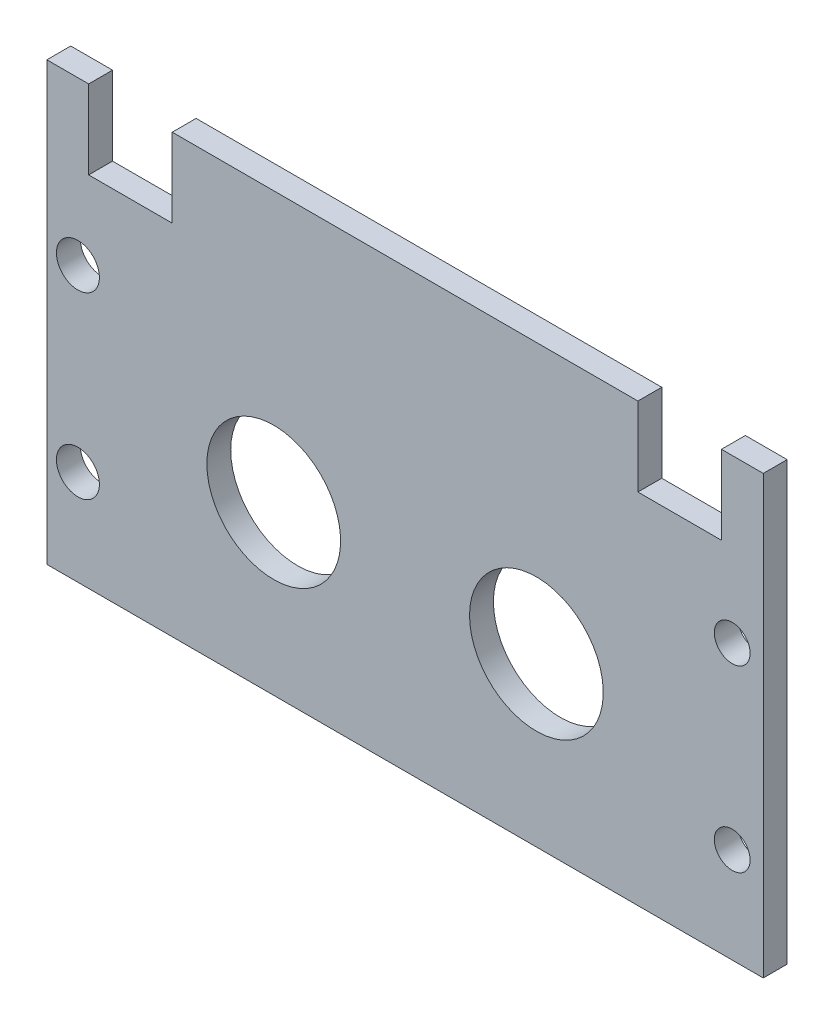
ISO-10303-21;
HEADER;
FILE_DESCRIPTION(('STEP AP214'),'2;1');
FILE_NAME('part.step','',(''),(''),'','','');
FILE_SCHEMA(('AUTOMOTIVE_DESIGN { 1 0 10303 214 1 1 1 1 }'));
ENDSEC;
DATA;
#1=APPLICATION_CONTEXT('core data for automotive mechanical design processes');
#2=APPLICATION_PROTOCOL_DEFINITION('international standard','automotive_design',2000,#1);
#3=PRODUCT_CONTEXT('',#1,'mechanical');
#4=PRODUCT('Part','Part','',(#3));
#5=PRODUCT_RELATED_PRODUCT_CATEGORY('part','',(#4));
#6=PRODUCT_DEFINITION_FORMATION('','',#4);
#7=PRODUCT_DEFINITION_CONTEXT('part definition',#1,'design');
#8=PRODUCT_DEFINITION('design','',#6,#7);
#9=PRODUCT_DEFINITION_SHAPE('','',#8);
#10=(LENGTH_UNIT() NAMED_UNIT(*) SI_UNIT(.MILLI.,.METRE.));
#11=(NAMED_UNIT(*) PLANE_ANGLE_UNIT() SI_UNIT($,.RADIAN.));
#12=(NAMED_UNIT(*) SI_UNIT($,.STERADIAN.) SOLID_ANGLE_UNIT());
#13=UNCERTAINTY_MEASURE_WITH_UNIT(LENGTH_MEASURE(1.E-05),#10,'distance_accuracy_value','');
#14=(GEOMETRIC_REPRESENTATION_CONTEXT(3) GLOBAL_UNCERTAINTY_ASSIGNED_CONTEXT((#13)) GLOBAL_UNIT_ASSIGNED_CONTEXT((#10,
#11,#12)) REPRESENTATION_CONTEXT('',''));
#15=CARTESIAN_POINT('',(0.,0.,0.));
#16=DIRECTION('',(0.,0.,1.));
#17=DIRECTION('',(1.,0.,0.));
#18=AXIS2_PLACEMENT_3D('',#15,#16,#17);
#19=CARTESIAN_POINT('',(-150.,75.,-10.));
#20=DIRECTION('',(0.,1.,0.));
#21=DIRECTION('',(0.,0.,1.));
#22=AXIS2_PLACEMENT_3D('',#19,#20,#21);
#23=PLANE('',#22);
#24=DIRECTION('',(0.,0.,-1.));
#25=VECTOR('',#24,1.);
#26=CARTESIAN_POINT('',(-97.5,75.,0.));
#27=LINE('',#26,#25);
#28=CARTESIAN_POINT('',(-97.5,75.,0.));
#29=VERTEX_POINT('',#28);
#30=CARTESIAN_POINT('',(-97.5,75.,-10.));
#31=VERTEX_POINT('',#30);
#32=EDGE_CURVE('E174',#29,#31,#27,.T.);
#33=ORIENTED_EDGE('',*,*,#32,.T.);
#34=DIRECTION('',(-1.,0.,0.));
#35=VECTOR('',#34,1.);
#36=CARTESIAN_POINT('',(-150.,75.,-10.));
#37=LINE('',#36,#35);
#38=CARTESIAN_POINT('',(-132.5,75.,-10.));
#39=VERTEX_POINT('',#38);
#40=EDGE_CURVE('E241',#31,#39,#37,.T.);
#41=ORIENTED_EDGE('',*,*,#40,.T.);
#42=DIRECTION('',(0.,0.,-1.));
#43=VECTOR('',#42,1.);
#44=CARTESIAN_POINT('',(-132.5,75.,0.));
#45=LINE('',#44,#43);
#46=CARTESIAN_POINT('',(-132.5,75.,0.));
#47=VERTEX_POINT('',#46);
#48=EDGE_CURVE('E196',#47,#39,#45,.T.);
#49=ORIENTED_EDGE('',*,*,#48,.F.);
#50=DIRECTION('',(-1.,0.,0.));
#51=VECTOR('',#50,1.);
#52=CARTESIAN_POINT('',(-150.,75.,0.));
#53=LINE('',#52,#51);
#54=EDGE_CURVE('E252',#29,#47,#53,.T.);
#55=ORIENTED_EDGE('',*,*,#54,.F.);
#56=EDGE_LOOP('',(#33,#41,#49,#55));
#57=FACE_BOUND('',#56,.T.);
#58=ADVANCED_FACE('F41',(#57),#23,.T.);
#59=CARTESIAN_POINT('',(150.,-75.,-10.));
#60=DIRECTION('',(1.,0.,0.));
#61=DIRECTION('',(0.,0.,-1.));
#62=AXIS2_PLACEMENT_3D('',#59,#60,#61);
#63=PLANE('',#62);
#64=DIRECTION('',(0.,1.,0.));
#65=VECTOR('',#64,1.);
#66=CARTESIAN_POINT('',(150.,-75.,0.));
#67=LINE('',#66,#65);
#68=CARTESIAN_POINT('',(150.,-75.,0.));
#69=VERTEX_POINT('',#68);
#70=CARTESIAN_POINT('',(150.,108.,0.));
#71=VERTEX_POINT('',#70);
#72=EDGE_CURVE('E143',#69,#71,#67,.T.);
#73=ORIENTED_EDGE('',*,*,#72,.F.);
#74=DIRECTION('',(0.,0.,1.));
#75=VECTOR('',#74,1.);
#76=CARTESIAN_POINT('',(150.,-75.,-10.));
#77=LINE('',#76,#75);
#78=CARTESIAN_POINT('',(150.,-75.,-10.));
#79=VERTEX_POINT('',#78);
#80=EDGE_CURVE('E11',#79,#69,#77,.T.);
#81=ORIENTED_EDGE('',*,*,#80,.F.);
#82=DIRECTION('',(0.,1.,0.));
#83=VECTOR('',#82,1.);
#84=CARTESIAN_POINT('',(150.,-75.,-10.));
#85=LINE('',#84,#83);
#86=CARTESIAN_POINT('',(150.,108.,-10.));
#87=VERTEX_POINT('',#86);
#88=EDGE_CURVE('E239',#79,#87,#85,.T.);
#89=ORIENTED_EDGE('',*,*,#88,.T.);
#90=DIRECTION('',(0.,0.,-1.));
#91=VECTOR('',#90,1.);
#92=CARTESIAN_POINT('',(150.,108.,0.));
#93=LINE('',#92,#91);
#94=EDGE_CURVE('E138',#71,#87,#93,.T.);
#95=ORIENTED_EDGE('',*,*,#94,.F.);
#96=EDGE_LOOP('',(#73,#81,#89,#95));
#97=FACE_BOUND('',#96,.T.);
#98=ADVANCED_FACE('F43',(#97),#63,.T.);
#99=CARTESIAN_POINT('',(-150.,-75.,-10.));
#100=DIRECTION('',(0.,-1.,0.));
#101=DIRECTION('',(0.,0.,-1.));
#102=AXIS2_PLACEMENT_3D('',#99,#100,#101);
#103=PLANE('',#102);
#104=DIRECTION('',(1.,0.,0.));
#105=VECTOR('',#104,1.);
#106=CARTESIAN_POINT('',(-150.,-75.,0.));
#107=LINE('',#106,#105);
#108=CARTESIAN_POINT('',(-150.,-75.,0.));
#109=VERTEX_POINT('',#108);
#110=EDGE_CURVE('E242',#109,#69,#107,.T.);
#111=ORIENTED_EDGE('',*,*,#110,.F.);
#112=DIRECTION('',(0.,0.,1.));
#113=VECTOR('',#112,1.);
#114=CARTESIAN_POINT('',(-150.,-75.,-10.));
#115=LINE('',#114,#113);
#116=CARTESIAN_POINT('',(-150.,-75.,-10.));
#117=VERTEX_POINT('',#116);
#118=EDGE_CURVE('E45',#117,#109,#115,.T.);
#119=ORIENTED_EDGE('',*,*,#118,.F.);
#120=DIRECTION('',(1.,0.,0.));
#121=VECTOR('',#120,1.);
#122=CARTESIAN_POINT('',(-150.,-75.,-10.));
#123=LINE('',#122,#121);
#124=EDGE_CURVE('E248',#117,#79,#123,.T.);
#125=ORIENTED_EDGE('',*,*,#124,.T.);
#126=ORIENTED_EDGE('',*,*,#80,.T.);
#127=EDGE_LOOP('',(#111,#119,#125,#126));
#128=FACE_BOUND('',#127,.T.);
#129=ADVANCED_FACE('F261',(#128),#103,.T.);
#130=CARTESIAN_POINT('',(-150.,-75.,-10.));
#131=DIRECTION('',(-1.,0.,0.));
#132=DIRECTION('',(0.,0.,1.));
#133=AXIS2_PLACEMENT_3D('',#130,#131,#132);
#134=PLANE('',#133);
#135=DIRECTION('',(0.,-1.,0.));
#136=VECTOR('',#135,1.);
#137=CARTESIAN_POINT('',(-150.,-75.,0.));
#138=LINE('',#137,#136);
#139=CARTESIAN_POINT('',(-150.,108.,0.));
#140=VERTEX_POINT('',#139);
#141=EDGE_CURVE('E255',#140,#109,#138,.T.);
#142=ORIENTED_EDGE('',*,*,#141,.F.);
#143=DIRECTION('',(0.,0.,-1.));
#144=VECTOR('',#143,1.);
#145=CARTESIAN_POINT('',(-150.,108.,0.));
#146=LINE('',#145,#144);
#147=CARTESIAN_POINT('',(-150.,108.,-10.));
#148=VERTEX_POINT('',#147);
#149=EDGE_CURVE('E191',#140,#148,#146,.T.);
#150=ORIENTED_EDGE('',*,*,#149,.T.);
#151=DIRECTION('',(0.,-1.,0.));
#152=VECTOR('',#151,1.);
#153=CARTESIAN_POINT('',(-150.,-75.,-10.));
#154=LINE('',#153,#152);
#155=EDGE_CURVE('E245',#148,#117,#154,.T.);
#156=ORIENTED_EDGE('',*,*,#155,.T.);
#157=ORIENTED_EDGE('',*,*,#118,.T.);
#158=EDGE_LOOP('',(#142,#150,#156,#157));
#159=FACE_BOUND('',#158,.T.);
#160=ADVANCED_FACE('F292',(#159),#134,.T.);
#161=DIRECTION('',(0.,0.,-1.));
#162=VECTOR('',#161,1.);
#163=CARTESIAN_POINT('',(132.5,75.,0.));
#164=LINE('',#163,#162);
#165=CARTESIAN_POINT('',(132.5,75.,0.));
#166=VERTEX_POINT('',#165);
#167=CARTESIAN_POINT('',(132.5,75.,-10.));
#168=VERTEX_POINT('',#167);
#169=EDGE_CURVE('E148',#166,#168,#164,.T.);
#170=ORIENTED_EDGE('',*,*,#169,.T.);
#171=CARTESIAN_POINT('',(97.5,75.,-10.));
#172=VERTEX_POINT('',#171);
#173=EDGE_CURVE('E243',#168,#172,#37,.T.);
#174=ORIENTED_EDGE('',*,*,#173,.T.);
#175=DIRECTION('',(0.,0.,-1.));
#176=VECTOR('',#175,1.);
#177=CARTESIAN_POINT('',(97.5,75.,0.));
#178=LINE('',#177,#176);
#179=CARTESIAN_POINT('',(97.5,75.,0.));
#180=VERTEX_POINT('',#179);
#181=EDGE_CURVE('E178',#180,#172,#178,.T.);
#182=ORIENTED_EDGE('',*,*,#181,.F.);
#183=EDGE_CURVE('E253',#166,#180,#53,.T.);
#184=ORIENTED_EDGE('',*,*,#183,.F.);
#185=EDGE_LOOP('',(#170,#174,#182,#184));
#186=FACE_BOUND('',#185,.T.);
#187=ADVANCED_FACE('F269',(#186),#23,.T.);
#188=CARTESIAN_POINT('',(0.,0.,-10.));
#189=DIRECTION('',(0.,0.,-1.));
#190=DIRECTION('',(-1.,0.,0.));
#191=AXIS2_PLACEMENT_3D('',#188,#189,#190);
#192=PLANE('',#191);
#193=CARTESIAN_POINT('',(-137.,-35.0000000000001,-10.));
#194=DIRECTION('',(0.,0.,-1.));
#195=DIRECTION('',(-1.,0.,0.));
#196=AXIS2_PLACEMENT_3D('',#193,#194,#195);
#197=CIRCLE('',#196,8.99999999999995);
#198=CARTESIAN_POINT('',(-146.,-35.0000000000001,-10.));
#199=VERTEX_POINT('',#198);
#200=EDGE_CURVE('E208',#199,#199,#197,.T.);
#201=ORIENTED_EDGE('',*,*,#200,.F.);
#202=EDGE_LOOP('',(#201));
#203=FACE_BOUND('',#202,.T.);
#204=CARTESIAN_POINT('',(-137.000000000001,40.,-10.));
#205=DIRECTION('',(0.,0.,-1.));
#206=DIRECTION('',(-1.,0.,0.));
#207=AXIS2_PLACEMENT_3D('',#204,#205,#206);
#208=CIRCLE('',#207,9.00000000000001);
#209=CARTESIAN_POINT('',(-146.000000000001,40.,-10.));
#210=VERTEX_POINT('',#209);
#211=EDGE_CURVE('E199',#210,#210,#208,.T.);
#212=ORIENTED_EDGE('',*,*,#211,.F.);
#213=EDGE_LOOP('',(#212));
#214=FACE_BOUND('',#213,.T.);
#215=CARTESIAN_POINT('',(137.,-35.,-10.));
#216=DIRECTION('',(0.,0.,-1.));
#217=DIRECTION('',(-1.,0.,0.));
#218=AXIS2_PLACEMENT_3D('',#215,#216,#217);
#219=CIRCLE('',#218,7.50000000000001);
#220=CARTESIAN_POINT('',(129.5,-35.,-10.));
#221=VERTEX_POINT('',#220);
#222=EDGE_CURVE('E220',#221,#221,#219,.T.);
#223=ORIENTED_EDGE('',*,*,#222,.F.);
#224=EDGE_LOOP('',(#223));
#225=FACE_BOUND('',#224,.T.);
#226=CARTESIAN_POINT('',(137.,40.,-10.));
#227=DIRECTION('',(0.,0.,-1.));
#228=DIRECTION('',(-1.,0.,0.));
#229=AXIS2_PLACEMENT_3D('',#226,#227,#228);
#230=CIRCLE('',#229,7.50000000000001);
#231=CARTESIAN_POINT('',(129.5,40.,-10.));
#232=VERTEX_POINT('',#231);
#233=EDGE_CURVE('E207',#232,#232,#230,.T.);
#234=ORIENTED_EDGE('',*,*,#233,.F.);
#235=EDGE_LOOP('',(#234));
#236=FACE_BOUND('',#235,.T.);
#237=CARTESIAN_POINT('',(55.,-4.99999999999999,-10.));
#238=DIRECTION('',(0.,0.,-1.));
#239=DIRECTION('',(-1.,0.,0.));
#240=AXIS2_PLACEMENT_3D('',#237,#238,#239);
#241=CIRCLE('',#240,28.);
#242=CARTESIAN_POINT('',(27.,-4.99999999999999,-10.));
#243=VERTEX_POINT('',#242);
#244=EDGE_CURVE('E231',#243,#243,#241,.T.);
#245=ORIENTED_EDGE('',*,*,#244,.F.);
#246=EDGE_LOOP('',(#245));
#247=FACE_BOUND('',#246,.T.);
#248=CARTESIAN_POINT('',(-55.,-4.99999999999999,-10.));
#249=DIRECTION('',(0.,0.,-1.));
#250=DIRECTION('',(-1.,0.,0.));
#251=AXIS2_PLACEMENT_3D('',#248,#249,#250);
#252=CIRCLE('',#251,28.);
#253=CARTESIAN_POINT('',(-83.,-4.99999999999999,-10.));
#254=VERTEX_POINT('',#253);
#255=EDGE_CURVE('E219',#254,#254,#252,.T.);
#256=ORIENTED_EDGE('',*,*,#255,.F.);
#257=EDGE_LOOP('',(#256));
#258=FACE_BOUND('',#257,.T.);
#259=ORIENTED_EDGE('',*,*,#88,.F.);
#260=ORIENTED_EDGE('',*,*,#124,.F.);
#261=ORIENTED_EDGE('',*,*,#155,.F.);
#262=DIRECTION('',(1.,0.,0.));
#263=VECTOR('',#262,1.);
#264=CARTESIAN_POINT('',(-150.,108.,-10.));
#265=LINE('',#264,#263);
#266=CARTESIAN_POINT('',(-132.5,108.,-10.));
#267=VERTEX_POINT('',#266);
#268=EDGE_CURVE('E177',#148,#267,#265,.T.);
#269=ORIENTED_EDGE('',*,*,#268,.T.);
#270=DIRECTION('',(0.,-1.,0.));
#271=VECTOR('',#270,1.);
#272=CARTESIAN_POINT('',(-132.5,75.,-10.));
#273=LINE('',#272,#271);
#274=EDGE_CURVE('E188',#267,#39,#273,.T.);
#275=ORIENTED_EDGE('',*,*,#274,.T.);
#276=ORIENTED_EDGE('',*,*,#40,.F.);
#277=DIRECTION('',(0.,1.,0.));
#278=VECTOR('',#277,1.);
#279=CARTESIAN_POINT('',(-97.5,75.,-10.));
#280=LINE('',#279,#278);
#281=CARTESIAN_POINT('',(-97.5,108.,-10.));
#282=VERTEX_POINT('',#281);
#283=EDGE_CURVE('E156',#31,#282,#280,.T.);
#284=ORIENTED_EDGE('',*,*,#283,.T.);
#285=DIRECTION('',(1.,0.,0.));
#286=VECTOR('',#285,1.);
#287=CARTESIAN_POINT('',(-97.5,108.,-10.));
#288=LINE('',#287,#286);
#289=CARTESIAN_POINT('',(97.5,108.,-10.));
#290=VERTEX_POINT('',#289);
#291=EDGE_CURVE('E169',#282,#290,#288,.T.);
#292=ORIENTED_EDGE('',*,*,#291,.T.);
#293=DIRECTION('',(0.,-1.,0.));
#294=VECTOR('',#293,1.);
#295=CARTESIAN_POINT('',(97.5,75.,-10.));
#296=LINE('',#295,#294);
#297=EDGE_CURVE('E160',#290,#172,#296,.T.);
#298=ORIENTED_EDGE('',*,*,#297,.T.);
#299=ORIENTED_EDGE('',*,*,#173,.F.);
#300=DIRECTION('',(0.,1.,0.));
#301=VECTOR('',#300,1.);
#302=CARTESIAN_POINT('',(132.5,75.,-10.));
#303=LINE('',#302,#301);
#304=CARTESIAN_POINT('',(132.5,108.,-10.));
#305=VERTEX_POINT('',#304);
#306=EDGE_CURVE('E151',#168,#305,#303,.T.);
#307=ORIENTED_EDGE('',*,*,#306,.T.);
#308=DIRECTION('',(1.,0.,0.));
#309=VECTOR('',#308,1.);
#310=CARTESIAN_POINT('',(132.5,108.,-10.));
#311=LINE('',#310,#309);
#312=EDGE_CURVE('E135',#305,#87,#311,.T.);
#313=ORIENTED_EDGE('',*,*,#312,.T.);
#314=EDGE_LOOP('',(#259,#260,#261,#269,#275,#276,#284,#292,#298,#299,#307,#313));
#315=FACE_BOUND('',#314,.T.);
#316=ADVANCED_FACE('F266',(#203,#214,#225,#236,#247,#258,#315),#192,.T.);
#317=CARTESIAN_POINT('',(0.,0.,0.));
#318=DIRECTION('',(0.,0.,-1.));
#319=DIRECTION('',(-1.,0.,0.));
#320=AXIS2_PLACEMENT_3D('',#317,#318,#319);
#321=PLANE('',#320);
#322=CARTESIAN_POINT('',(-137.,-35.0000000000001,0.));
#323=DIRECTION('',(0.,0.,-1.));
#324=DIRECTION('',(-1.,0.,0.));
#325=AXIS2_PLACEMENT_3D('',#322,#323,#324);
#326=CIRCLE('',#325,8.99999999999995);
#327=CARTESIAN_POINT('',(-146.,-35.0000000000001,0.));
#328=VERTEX_POINT('',#327);
#329=EDGE_CURVE('E204',#328,#328,#326,.T.);
#330=ORIENTED_EDGE('',*,*,#329,.T.);
#331=EDGE_LOOP('',(#330));
#332=FACE_BOUND('',#331,.T.);
#333=CARTESIAN_POINT('',(-137.000000000001,40.,0.));
#334=DIRECTION('',(0.,0.,-1.));
#335=DIRECTION('',(-1.,0.,0.));
#336=AXIS2_PLACEMENT_3D('',#333,#334,#335);
#337=CIRCLE('',#336,9.00000000000001);
#338=CARTESIAN_POINT('',(-146.000000000001,40.,0.));
#339=VERTEX_POINT('',#338);
#340=EDGE_CURVE('E211',#339,#339,#337,.T.);
#341=ORIENTED_EDGE('',*,*,#340,.T.);
#342=EDGE_LOOP('',(#341));
#343=FACE_BOUND('',#342,.T.);
#344=CARTESIAN_POINT('',(137.,-35.,0.));
#345=DIRECTION('',(0.,0.,-1.));
#346=DIRECTION('',(-1.,0.,0.));
#347=AXIS2_PLACEMENT_3D('',#344,#345,#346);
#348=CIRCLE('',#347,7.50000000000001);
#349=CARTESIAN_POINT('',(129.5,-35.,0.));
#350=VERTEX_POINT('',#349);
#351=EDGE_CURVE('E216',#350,#350,#348,.T.);
#352=ORIENTED_EDGE('',*,*,#351,.T.);
#353=EDGE_LOOP('',(#352));
#354=FACE_BOUND('',#353,.T.);
#355=CARTESIAN_POINT('',(137.,40.,0.));
#356=DIRECTION('',(0.,0.,-1.));
#357=DIRECTION('',(-1.,0.,0.));
#358=AXIS2_PLACEMENT_3D('',#355,#356,#357);
#359=CIRCLE('',#358,7.50000000000001);
#360=CARTESIAN_POINT('',(129.5,40.,0.));
#361=VERTEX_POINT('',#360);
#362=EDGE_CURVE('E223',#361,#361,#359,.T.);
#363=ORIENTED_EDGE('',*,*,#362,.T.);
#364=EDGE_LOOP('',(#363));
#365=FACE_BOUND('',#364,.T.);
#366=CARTESIAN_POINT('',(55.,-4.99999999999999,0.));
#367=DIRECTION('',(0.,0.,-1.));
#368=DIRECTION('',(-1.,0.,0.));
#369=AXIS2_PLACEMENT_3D('',#366,#367,#368);
#370=CIRCLE('',#369,28.);
#371=CARTESIAN_POINT('',(27.,-4.99999999999999,0.));
#372=VERTEX_POINT('',#371);
#373=EDGE_CURVE('E228',#372,#372,#370,.T.);
#374=ORIENTED_EDGE('',*,*,#373,.T.);
#375=EDGE_LOOP('',(#374));
#376=FACE_BOUND('',#375,.T.);
#377=CARTESIAN_POINT('',(-55.,-4.99999999999999,0.));
#378=DIRECTION('',(0.,0.,-1.));
#379=DIRECTION('',(-1.,0.,0.));
#380=AXIS2_PLACEMENT_3D('',#377,#378,#379);
#381=CIRCLE('',#380,28.);
#382=CARTESIAN_POINT('',(-83.,-4.99999999999999,0.));
#383=VERTEX_POINT('',#382);
#384=EDGE_CURVE('E234',#383,#383,#381,.T.);
#385=ORIENTED_EDGE('',*,*,#384,.T.);
#386=EDGE_LOOP('',(#385));
#387=FACE_BOUND('',#386,.T.);
#388=ORIENTED_EDGE('',*,*,#72,.T.);
#389=DIRECTION('',(1.,0.,0.));
#390=VECTOR('',#389,1.);
#391=CARTESIAN_POINT('',(132.5,108.,0.));
#392=LINE('',#391,#390);
#393=CARTESIAN_POINT('',(132.5,108.,0.));
#394=VERTEX_POINT('',#393);
#395=EDGE_CURVE('E133',#394,#71,#392,.T.);
#396=ORIENTED_EDGE('',*,*,#395,.F.);
#397=DIRECTION('',(0.,1.,0.));
#398=VECTOR('',#397,1.);
#399=CARTESIAN_POINT('',(132.5,75.,0.));
#400=LINE('',#399,#398);
#401=EDGE_CURVE('E56',#166,#394,#400,.T.);
#402=ORIENTED_EDGE('',*,*,#401,.F.);
#403=ORIENTED_EDGE('',*,*,#183,.T.);
#404=DIRECTION('',(0.,-1.,0.));
#405=VECTOR('',#404,1.);
#406=CARTESIAN_POINT('',(97.5,75.,0.));
#407=LINE('',#406,#405);
#408=CARTESIAN_POINT('',(97.5,108.,0.));
#409=VERTEX_POINT('',#408);
#410=EDGE_CURVE('E163',#409,#180,#407,.T.);
#411=ORIENTED_EDGE('',*,*,#410,.F.);
#412=DIRECTION('',(1.,0.,0.));
#413=VECTOR('',#412,1.);
#414=CARTESIAN_POINT('',(-97.5,108.,0.));
#415=LINE('',#414,#413);
#416=CARTESIAN_POINT('',(-97.5,108.,0.));
#417=VERTEX_POINT('',#416);
#418=EDGE_CURVE('E159',#417,#409,#415,.T.);
#419=ORIENTED_EDGE('',*,*,#418,.F.);
#420=DIRECTION('',(0.,1.,0.));
#421=VECTOR('',#420,1.);
#422=CARTESIAN_POINT('',(-97.5,75.,0.));
#423=LINE('',#422,#421);
#424=EDGE_CURVE('E63',#29,#417,#423,.T.);
#425=ORIENTED_EDGE('',*,*,#424,.F.);
#426=ORIENTED_EDGE('',*,*,#54,.T.);
#427=DIRECTION('',(0.,-1.,0.));
#428=VECTOR('',#427,1.);
#429=CARTESIAN_POINT('',(-132.5,75.,0.));
#430=LINE('',#429,#428);
#431=CARTESIAN_POINT('',(-132.5,108.,0.));
#432=VERTEX_POINT('',#431);
#433=EDGE_CURVE('E187',#432,#47,#430,.T.);
#434=ORIENTED_EDGE('',*,*,#433,.F.);
#435=DIRECTION('',(1.,0.,0.));
#436=VECTOR('',#435,1.);
#437=CARTESIAN_POINT('',(-150.,108.,0.));
#438=LINE('',#437,#436);
#439=EDGE_CURVE('E184',#140,#432,#438,.T.);
#440=ORIENTED_EDGE('',*,*,#439,.F.);
#441=ORIENTED_EDGE('',*,*,#141,.T.);
#442=ORIENTED_EDGE('',*,*,#110,.T.);
#443=EDGE_LOOP('',(#388,#396,#402,#403,#411,#419,#425,#426,#434,#440,#441,#442));
#444=FACE_BOUND('',#443,.T.);
#445=ADVANCED_FACE('F140',(#332,#343,#354,#365,#376,#387,#444),#321,.F.);
#446=CARTESIAN_POINT('',(-55.,-4.99999999999999,0.));
#447=DIRECTION('',(0.,0.,-1.));
#448=DIRECTION('',(-1.,0.,0.));
#449=AXIS2_PLACEMENT_3D('',#446,#447,#448);
#450=CYLINDRICAL_SURFACE('',#449,28.);
#451=ORIENTED_EDGE('',*,*,#384,.F.);
#452=EDGE_LOOP('',(#451));
#453=FACE_BOUND('',#452,.T.);
#454=ORIENTED_EDGE('',*,*,#255,.T.);
#455=EDGE_LOOP('',(#454));
#456=FACE_BOUND('',#455,.T.);
#457=ADVANCED_FACE('F327',(#453,#456),#450,.F.);
#458=CARTESIAN_POINT('',(55.,-4.99999999999999,0.));
#459=DIRECTION('',(0.,0.,-1.));
#460=DIRECTION('',(-1.,0.,0.));
#461=AXIS2_PLACEMENT_3D('',#458,#459,#460);
#462=CYLINDRICAL_SURFACE('',#461,28.);
#463=ORIENTED_EDGE('',*,*,#373,.F.);
#464=EDGE_LOOP('',(#463));
#465=FACE_BOUND('',#464,.T.);
#466=ORIENTED_EDGE('',*,*,#244,.T.);
#467=EDGE_LOOP('',(#466));
#468=FACE_BOUND('',#467,.T.);
#469=ADVANCED_FACE('F332',(#465,#468),#462,.F.);
#470=CARTESIAN_POINT('',(137.,40.,0.));
#471=DIRECTION('',(0.,0.,-1.));
#472=DIRECTION('',(-1.,0.,0.));
#473=AXIS2_PLACEMENT_3D('',#470,#471,#472);
#474=CYLINDRICAL_SURFACE('',#473,7.50000000000001);
#475=ORIENTED_EDGE('',*,*,#362,.F.);
#476=EDGE_LOOP('',(#475));
#477=FACE_BOUND('',#476,.T.);
#478=ORIENTED_EDGE('',*,*,#233,.T.);
#479=EDGE_LOOP('',(#478));
#480=FACE_BOUND('',#479,.T.);
#481=ADVANCED_FACE('F336',(#477,#480),#474,.F.);
#482=CARTESIAN_POINT('',(137.,-35.,0.));
#483=DIRECTION('',(0.,0.,-1.));
#484=DIRECTION('',(-1.,0.,0.));
#485=AXIS2_PLACEMENT_3D('',#482,#483,#484);
#486=CYLINDRICAL_SURFACE('',#485,7.50000000000001);
#487=ORIENTED_EDGE('',*,*,#351,.F.);
#488=EDGE_LOOP('',(#487));
#489=FACE_BOUND('',#488,.T.);
#490=ORIENTED_EDGE('',*,*,#222,.T.);
#491=EDGE_LOOP('',(#490));
#492=FACE_BOUND('',#491,.T.);
#493=ADVANCED_FACE('F340',(#489,#492),#486,.F.);
#494=CARTESIAN_POINT('',(-137.000000000001,40.,0.));
#495=DIRECTION('',(0.,0.,-1.));
#496=DIRECTION('',(-1.,0.,0.));
#497=AXIS2_PLACEMENT_3D('',#494,#495,#496);
#498=CYLINDRICAL_SURFACE('',#497,9.00000000000001);
#499=ORIENTED_EDGE('',*,*,#340,.F.);
#500=EDGE_LOOP('',(#499));
#501=FACE_BOUND('',#500,.T.);
#502=ORIENTED_EDGE('',*,*,#211,.T.);
#503=EDGE_LOOP('',(#502));
#504=FACE_BOUND('',#503,.T.);
#505=ADVANCED_FACE('F302',(#501,#504),#498,.F.);
#506=CARTESIAN_POINT('',(-137.,-35.0000000000001,0.));
#507=DIRECTION('',(0.,0.,-1.));
#508=DIRECTION('',(-1.,0.,0.));
#509=AXIS2_PLACEMENT_3D('',#506,#507,#508);
#510=CYLINDRICAL_SURFACE('',#509,8.99999999999995);
#511=ORIENTED_EDGE('',*,*,#329,.F.);
#512=EDGE_LOOP('',(#511));
#513=FACE_BOUND('',#512,.T.);
#514=ORIENTED_EDGE('',*,*,#200,.T.);
#515=EDGE_LOOP('',(#514));
#516=FACE_BOUND('',#515,.T.);
#517=ADVANCED_FACE('F295',(#513,#516),#510,.F.);
#518=CARTESIAN_POINT('',(-132.5,75.,0.));
#519=DIRECTION('',(1.,0.,0.));
#520=DIRECTION('',(0.,0.,-1.));
#521=AXIS2_PLACEMENT_3D('',#518,#519,#520);
#522=PLANE('',#521);
#523=ORIENTED_EDGE('',*,*,#274,.F.);
#524=DIRECTION('',(0.,0.,-1.));
#525=VECTOR('',#524,1.);
#526=CARTESIAN_POINT('',(-132.5,108.,0.));
#527=LINE('',#526,#525);
#528=EDGE_CURVE('E200',#432,#267,#527,.T.);
#529=ORIENTED_EDGE('',*,*,#528,.F.);
#530=ORIENTED_EDGE('',*,*,#433,.T.);
#531=ORIENTED_EDGE('',*,*,#48,.T.);
#532=EDGE_LOOP('',(#523,#529,#530,#531));
#533=FACE_BOUND('',#532,.T.);
#534=ADVANCED_FACE('F293',(#533),#522,.T.);
#535=CARTESIAN_POINT('',(-150.,108.,0.));
#536=DIRECTION('',(0.,1.,0.));
#537=DIRECTION('',(0.,0.,1.));
#538=AXIS2_PLACEMENT_3D('',#535,#536,#537);
#539=PLANE('',#538);
#540=ORIENTED_EDGE('',*,*,#268,.F.);
#541=ORIENTED_EDGE('',*,*,#149,.F.);
#542=ORIENTED_EDGE('',*,*,#439,.T.);
#543=ORIENTED_EDGE('',*,*,#528,.T.);
#544=EDGE_LOOP('',(#540,#541,#542,#543));
#545=FACE_BOUND('',#544,.T.);
#546=ADVANCED_FACE('F289',(#545),#539,.T.);
#547=CARTESIAN_POINT('',(-97.5,75.,0.));
#548=DIRECTION('',(-1.,0.,0.));
#549=DIRECTION('',(0.,0.,1.));
#550=AXIS2_PLACEMENT_3D('',#547,#548,#549);
#551=PLANE('',#550);
#552=ORIENTED_EDGE('',*,*,#283,.F.);
#553=ORIENTED_EDGE('',*,*,#32,.F.);
#554=ORIENTED_EDGE('',*,*,#424,.T.);
#555=DIRECTION('',(0.,0.,-1.));
#556=VECTOR('',#555,1.);
#557=CARTESIAN_POINT('',(-97.5,108.,0.));
#558=LINE('',#557,#556);
#559=EDGE_CURVE('E166',#417,#282,#558,.T.);
#560=ORIENTED_EDGE('',*,*,#559,.T.);
#561=EDGE_LOOP('',(#552,#553,#554,#560));
#562=FACE_BOUND('',#561,.T.);
#563=ADVANCED_FACE('F279',(#562),#551,.T.);
#564=CARTESIAN_POINT('',(97.5,75.,0.));
#565=DIRECTION('',(1.,0.,0.));
#566=DIRECTION('',(0.,0.,-1.));
#567=AXIS2_PLACEMENT_3D('',#564,#565,#566);
#568=PLANE('',#567);
#569=ORIENTED_EDGE('',*,*,#297,.F.);
#570=DIRECTION('',(0.,0.,-1.));
#571=VECTOR('',#570,1.);
#572=CARTESIAN_POINT('',(97.5,108.,0.));
#573=LINE('',#572,#571);
#574=EDGE_CURVE('E181',#409,#290,#573,.T.);
#575=ORIENTED_EDGE('',*,*,#574,.F.);
#576=ORIENTED_EDGE('',*,*,#410,.T.);
#577=ORIENTED_EDGE('',*,*,#181,.T.);
#578=EDGE_LOOP('',(#569,#575,#576,#577));
#579=FACE_BOUND('',#578,.T.);
#580=ADVANCED_FACE('F274',(#579),#568,.T.);
#581=CARTESIAN_POINT('',(-97.5,108.,0.));
#582=DIRECTION('',(0.,1.,0.));
#583=DIRECTION('',(0.,0.,1.));
#584=AXIS2_PLACEMENT_3D('',#581,#582,#583);
#585=PLANE('',#584);
#586=ORIENTED_EDGE('',*,*,#291,.F.);
#587=ORIENTED_EDGE('',*,*,#559,.F.);
#588=ORIENTED_EDGE('',*,*,#418,.T.);
#589=ORIENTED_EDGE('',*,*,#574,.T.);
#590=EDGE_LOOP('',(#586,#587,#588,#589));
#591=FACE_BOUND('',#590,.T.);
#592=ADVANCED_FACE('F277',(#591),#585,.T.);
#593=CARTESIAN_POINT('',(132.5,75.,0.));
#594=DIRECTION('',(-1.,0.,0.));
#595=DIRECTION('',(0.,0.,1.));
#596=AXIS2_PLACEMENT_3D('',#593,#594,#595);
#597=PLANE('',#596);
#598=ORIENTED_EDGE('',*,*,#306,.F.);
#599=ORIENTED_EDGE('',*,*,#169,.F.);
#600=ORIENTED_EDGE('',*,*,#401,.T.);
#601=DIRECTION('',(0.,0.,-1.));
#602=VECTOR('',#601,1.);
#603=CARTESIAN_POINT('',(132.5,108.,0.));
#604=LINE('',#603,#602);
#605=EDGE_CURVE('E130',#394,#305,#604,.T.);
#606=ORIENTED_EDGE('',*,*,#605,.T.);
#607=EDGE_LOOP('',(#598,#599,#600,#606));
#608=FACE_BOUND('',#607,.T.);
#609=ADVANCED_FACE('F146',(#608),#597,.T.);
#610=CARTESIAN_POINT('',(132.5,108.,0.));
#611=DIRECTION('',(0.,1.,0.));
#612=DIRECTION('',(0.,0.,1.));
#613=AXIS2_PLACEMENT_3D('',#610,#611,#612);
#614=PLANE('',#613);
#615=ORIENTED_EDGE('',*,*,#312,.F.);
#616=ORIENTED_EDGE('',*,*,#605,.F.);
#617=ORIENTED_EDGE('',*,*,#395,.T.);
#618=ORIENTED_EDGE('',*,*,#94,.T.);
#619=EDGE_LOOP('',(#615,#616,#617,#618));
#620=FACE_BOUND('',#619,.T.);
#621=ADVANCED_FACE('F131',(#620),#614,.T.);
#622=CLOSED_SHELL('',(#58,#98,#129,#160,#187,#316,#445,#457,#469,#481,#493,#505,#517,#534,#546,
#563,#580,#592,#609,#621));
#623=MANIFOLD_SOLID_BREP('B2',#622);
#624=ADVANCED_BREP_SHAPE_REPRESENTATION('',(#18,#623),#14);
#625=SHAPE_DEFINITION_REPRESENTATION(#9,#624);
ENDSEC;
END-ISO-10303-21;
